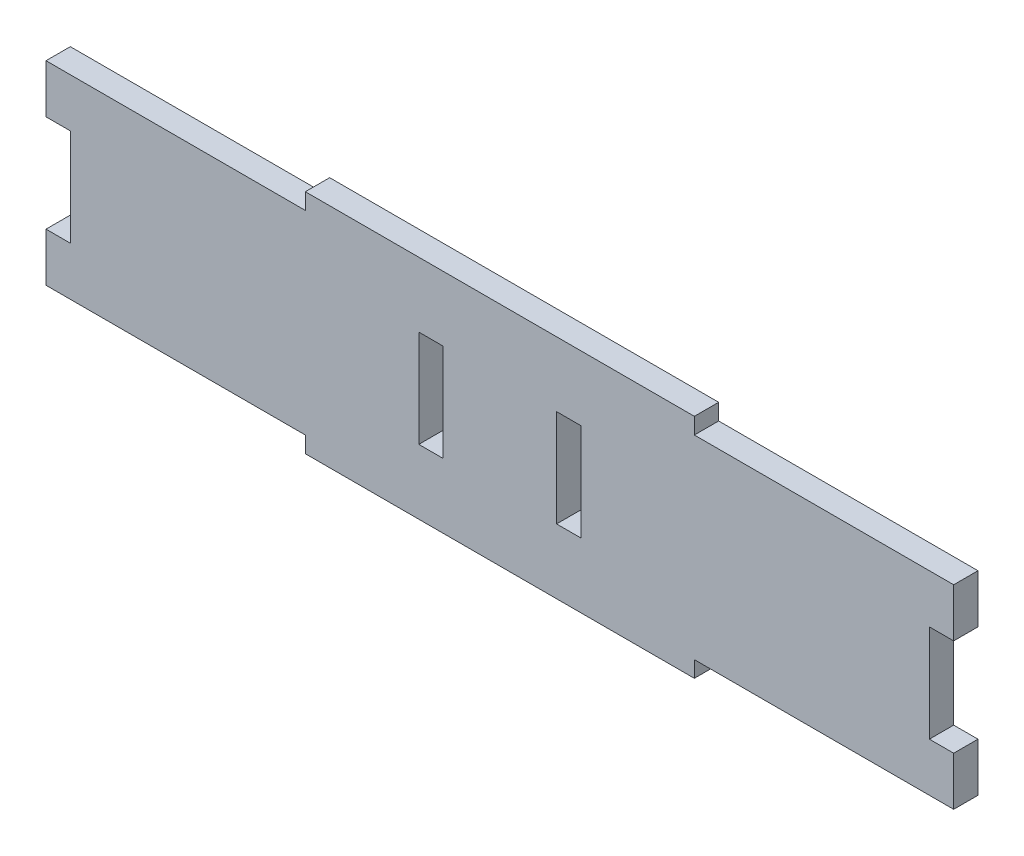
ISO-10303-21;
HEADER;
FILE_DESCRIPTION(('STEP AP214'),'2;1');
FILE_NAME('part.step','',(''),(''),'','','');
FILE_SCHEMA(('AUTOMOTIVE_DESIGN { 1 0 10303 214 1 1 1 1 }'));
ENDSEC;
DATA;
#1=APPLICATION_CONTEXT('core data for automotive mechanical design processes');
#2=APPLICATION_PROTOCOL_DEFINITION('international standard','automotive_design',2000,#1);
#3=PRODUCT_CONTEXT('',#1,'mechanical');
#4=PRODUCT('Part','Part','',(#3));
#5=PRODUCT_RELATED_PRODUCT_CATEGORY('part','',(#4));
#6=PRODUCT_DEFINITION_FORMATION('','',#4);
#7=PRODUCT_DEFINITION_CONTEXT('part definition',#1,'design');
#8=PRODUCT_DEFINITION('design','',#6,#7);
#9=PRODUCT_DEFINITION_SHAPE('','',#8);
#10=(LENGTH_UNIT() NAMED_UNIT(*) SI_UNIT(.MILLI.,.METRE.));
#11=(NAMED_UNIT(*) PLANE_ANGLE_UNIT() SI_UNIT($,.RADIAN.));
#12=(NAMED_UNIT(*) SI_UNIT($,.STERADIAN.) SOLID_ANGLE_UNIT());
#13=UNCERTAINTY_MEASURE_WITH_UNIT(LENGTH_MEASURE(1.E-05),#10,'distance_accuracy_value','');
#14=(GEOMETRIC_REPRESENTATION_CONTEXT(3) GLOBAL_UNCERTAINTY_ASSIGNED_CONTEXT((#13)) GLOBAL_UNIT_ASSIGNED_CONTEXT((#10,
#11,#12)) REPRESENTATION_CONTEXT('',''));
#15=CARTESIAN_POINT('',(0.,0.,0.));
#16=DIRECTION('',(0.,0.,1.));
#17=DIRECTION('',(1.,0.,0.));
#18=AXIS2_PLACEMENT_3D('',#15,#16,#17);
#19=CARTESIAN_POINT('',(0.,-19.0500000000008,9.525));
#20=DIRECTION('',(0.,1.,0.));
#21=DIRECTION('',(-1.,0.,0.));
#22=AXIS2_PLACEMENT_3D('',#19,#20,#21);
#23=PLANE('',#22);
#24=DIRECTION('',(1.,0.,0.));
#25=VECTOR('',#24,1.);
#26=CARTESIAN_POINT('',(0.,-19.0500000000008,0.));
#27=LINE('',#26,#25);
#28=CARTESIAN_POINT('',(168.275,-19.05,0.));
#29=VERTEX_POINT('',#28);
#30=CARTESIAN_POINT('',(177.8,-19.05,0.));
#31=VERTEX_POINT('',#30);
#32=EDGE_CURVE('E254',#29,#31,#27,.T.);
#33=ORIENTED_EDGE('',*,*,#32,.F.);
#34=DIRECTION('',(0.,0.,-1.));
#35=VECTOR('',#34,1.);
#36=CARTESIAN_POINT('',(168.275,-19.05,9.525));
#37=LINE('',#36,#35);
#38=CARTESIAN_POINT('',(168.275,-19.05,9.525));
#39=VERTEX_POINT('',#38);
#40=EDGE_CURVE('E11',#39,#29,#37,.T.);
#41=ORIENTED_EDGE('',*,*,#40,.F.);
#42=DIRECTION('',(1.,0.,0.));
#43=VECTOR('',#42,1.);
#44=CARTESIAN_POINT('',(0.,-19.0500000000008,9.525));
#45=LINE('',#44,#43);
#46=CARTESIAN_POINT('',(177.8,-19.05,9.525));
#47=VERTEX_POINT('',#46);
#48=EDGE_CURVE('E287',#39,#47,#45,.T.);
#49=ORIENTED_EDGE('',*,*,#48,.T.);
#50=DIRECTION('',(0.,0.,-1.));
#51=VECTOR('',#50,1.);
#52=CARTESIAN_POINT('',(177.8,-19.05,9.525));
#53=LINE('',#52,#51);
#54=EDGE_CURVE('E387',#47,#31,#53,.T.);
#55=ORIENTED_EDGE('',*,*,#54,.T.);
#56=EDGE_LOOP('',(#33,#41,#49,#55));
#57=FACE_BOUND('',#56,.T.);
#58=ADVANCED_FACE('F34',(#57),#23,.T.);
#59=CARTESIAN_POINT('',(168.275,0.,9.525));
#60=DIRECTION('',(-1.,0.,0.));
#61=DIRECTION('',(0.,0.,1.));
#62=AXIS2_PLACEMENT_3D('',#59,#60,#61);
#63=PLANE('',#62);
#64=DIRECTION('',(0.,1.,0.));
#65=VECTOR('',#64,1.);
#66=CARTESIAN_POINT('',(168.275,0.,0.));
#67=LINE('',#66,#65);
#68=CARTESIAN_POINT('',(168.275,19.05,0.));
#69=VERTEX_POINT('',#68);
#70=EDGE_CURVE('E337',#29,#69,#67,.T.);
#71=ORIENTED_EDGE('',*,*,#70,.T.);
#72=DIRECTION('',(0.,0.,-1.));
#73=VECTOR('',#72,1.);
#74=CARTESIAN_POINT('',(168.275,19.05,9.525));
#75=LINE('',#74,#73);
#76=CARTESIAN_POINT('',(168.275,19.05,9.525));
#77=VERTEX_POINT('',#76);
#78=EDGE_CURVE('E41',#77,#69,#75,.T.);
#79=ORIENTED_EDGE('',*,*,#78,.F.);
#80=DIRECTION('',(0.,1.,0.));
#81=VECTOR('',#80,1.);
#82=CARTESIAN_POINT('',(168.275,0.,9.525));
#83=LINE('',#82,#81);
#84=EDGE_CURVE('E290',#39,#77,#83,.T.);
#85=ORIENTED_EDGE('',*,*,#84,.F.);
#86=ORIENTED_EDGE('',*,*,#40,.T.);
#87=EDGE_LOOP('',(#71,#79,#85,#86));
#88=FACE_BOUND('',#87,.T.);
#89=ADVANCED_FACE('F432',(#88),#63,.F.);
#90=CARTESIAN_POINT('',(0.,19.0499999999992,9.525));
#91=DIRECTION('',(0.,-1.,0.));
#92=DIRECTION('',(1.,0.,0.));
#93=AXIS2_PLACEMENT_3D('',#90,#91,#92);
#94=PLANE('',#93);
#95=DIRECTION('',(-1.,0.,0.));
#96=VECTOR('',#95,1.);
#97=CARTESIAN_POINT('',(0.,19.0499999999992,0.));
#98=LINE('',#97,#96);
#99=CARTESIAN_POINT('',(177.8,19.05,0.));
#100=VERTEX_POINT('',#99);
#101=EDGE_CURVE('E340',#100,#69,#98,.T.);
#102=ORIENTED_EDGE('',*,*,#101,.F.);
#103=DIRECTION('',(0.,0.,-1.));
#104=VECTOR('',#103,1.);
#105=CARTESIAN_POINT('',(177.8,19.05,9.525));
#106=LINE('',#105,#104);
#107=CARTESIAN_POINT('',(177.8,19.05,9.525));
#108=VERTEX_POINT('',#107);
#109=EDGE_CURVE('E423',#108,#100,#106,.T.);
#110=ORIENTED_EDGE('',*,*,#109,.F.);
#111=DIRECTION('',(-1.,0.,0.));
#112=VECTOR('',#111,1.);
#113=CARTESIAN_POINT('',(0.,19.0499999999992,9.525));
#114=LINE('',#113,#112);
#115=EDGE_CURVE('E293',#108,#77,#114,.T.);
#116=ORIENTED_EDGE('',*,*,#115,.T.);
#117=ORIENTED_EDGE('',*,*,#78,.T.);
#118=EDGE_LOOP('',(#102,#110,#116,#117));
#119=FACE_BOUND('',#118,.T.);
#120=ADVANCED_FACE('F427',(#119),#94,.T.);
#121=CARTESIAN_POINT('',(177.8,0.,9.525));
#122=DIRECTION('',(-1.,0.,0.));
#123=DIRECTION('',(0.,0.,1.));
#124=AXIS2_PLACEMENT_3D('',#121,#122,#123);
#125=PLANE('',#124);
#126=DIRECTION('',(0.,1.,0.));
#127=VECTOR('',#126,1.);
#128=CARTESIAN_POINT('',(177.8,0.,0.));
#129=LINE('',#128,#127);
#130=CARTESIAN_POINT('',(177.8,38.1,0.));
#131=VERTEX_POINT('',#130);
#132=EDGE_CURVE('E343',#100,#131,#129,.T.);
#133=ORIENTED_EDGE('',*,*,#132,.T.);
#134=DIRECTION('',(0.,0.,-1.));
#135=VECTOR('',#134,1.);
#136=CARTESIAN_POINT('',(177.8,38.1,9.525));
#137=LINE('',#136,#135);
#138=CARTESIAN_POINT('',(177.8,38.1,9.525));
#139=VERTEX_POINT('',#138);
#140=EDGE_CURVE('E421',#139,#131,#137,.T.);
#141=ORIENTED_EDGE('',*,*,#140,.F.);
#142=DIRECTION('',(0.,1.,0.));
#143=VECTOR('',#142,1.);
#144=CARTESIAN_POINT('',(177.8,0.,9.525));
#145=LINE('',#144,#143);
#146=EDGE_CURVE('E296',#108,#139,#145,.T.);
#147=ORIENTED_EDGE('',*,*,#146,.F.);
#148=ORIENTED_EDGE('',*,*,#109,.T.);
#149=EDGE_LOOP('',(#133,#141,#147,#148));
#150=FACE_BOUND('',#149,.T.);
#151=ADVANCED_FACE('F440',(#150),#125,.F.);
#152=CARTESIAN_POINT('',(0.,38.1,9.525));
#153=DIRECTION('',(0.,1.,0.));
#154=DIRECTION('',(0.,0.,1.));
#155=AXIS2_PLACEMENT_3D('',#152,#153,#154);
#156=PLANE('',#155);
#157=DIRECTION('',(1.,0.,0.));
#158=VECTOR('',#157,1.);
#159=CARTESIAN_POINT('',(0.,38.1,0.));
#160=LINE('',#159,#158);
#161=CARTESIAN_POINT('',(76.2,38.1,0.));
#162=VERTEX_POINT('',#161);
#163=EDGE_CURVE('E346',#162,#131,#160,.T.);
#164=ORIENTED_EDGE('',*,*,#163,.F.);
#165=DIRECTION('',(0.,0.,-1.));
#166=VECTOR('',#165,1.);
#167=CARTESIAN_POINT('',(76.2,38.1,9.525));
#168=LINE('',#167,#166);
#169=CARTESIAN_POINT('',(76.2,38.1,9.525));
#170=VERTEX_POINT('',#169);
#171=EDGE_CURVE('E419',#170,#162,#168,.T.);
#172=ORIENTED_EDGE('',*,*,#171,.F.);
#173=DIRECTION('',(1.,0.,0.));
#174=VECTOR('',#173,1.);
#175=CARTESIAN_POINT('',(0.,38.1,9.525));
#176=LINE('',#175,#174);
#177=EDGE_CURVE('E298',#170,#139,#176,.T.);
#178=ORIENTED_EDGE('',*,*,#177,.T.);
#179=ORIENTED_EDGE('',*,*,#140,.T.);
#180=EDGE_LOOP('',(#164,#172,#178,#179));
#181=FACE_BOUND('',#180,.T.);
#182=ADVANCED_FACE('F515',(#181),#156,.T.);
#183=CARTESIAN_POINT('',(76.2,0.,9.525));
#184=DIRECTION('',(-1.,0.,0.));
#185=DIRECTION('',(0.,0.,1.));
#186=AXIS2_PLACEMENT_3D('',#183,#184,#185);
#187=PLANE('',#186);
#188=DIRECTION('',(0.,1.,0.));
#189=VECTOR('',#188,1.);
#190=CARTESIAN_POINT('',(76.2,0.,0.));
#191=LINE('',#190,#189);
#192=CARTESIAN_POINT('',(76.2,44.45,0.));
#193=VERTEX_POINT('',#192);
#194=EDGE_CURVE('E349',#162,#193,#191,.T.);
#195=ORIENTED_EDGE('',*,*,#194,.T.);
#196=DIRECTION('',(0.,0.,-1.));
#197=VECTOR('',#196,1.);
#198=CARTESIAN_POINT('',(76.2,44.45,9.525));
#199=LINE('',#198,#197);
#200=CARTESIAN_POINT('',(76.2,44.45,9.525));
#201=VERTEX_POINT('',#200);
#202=EDGE_CURVE('E417',#201,#193,#199,.T.);
#203=ORIENTED_EDGE('',*,*,#202,.F.);
#204=DIRECTION('',(0.,1.,0.));
#205=VECTOR('',#204,1.);
#206=CARTESIAN_POINT('',(76.2,0.,9.525));
#207=LINE('',#206,#205);
#208=EDGE_CURVE('E302',#170,#201,#207,.T.);
#209=ORIENTED_EDGE('',*,*,#208,.F.);
#210=ORIENTED_EDGE('',*,*,#171,.T.);
#211=EDGE_LOOP('',(#195,#203,#209,#210));
#212=FACE_BOUND('',#211,.T.);
#213=ADVANCED_FACE('F513',(#212),#187,.F.);
#214=CARTESIAN_POINT('',(0.,44.45,9.525));
#215=DIRECTION('',(0.,1.,0.));
#216=DIRECTION('',(0.,0.,1.));
#217=AXIS2_PLACEMENT_3D('',#214,#215,#216);
#218=PLANE('',#217);
#219=DIRECTION('',(1.,0.,0.));
#220=VECTOR('',#219,1.);
#221=CARTESIAN_POINT('',(0.,44.45,0.));
#222=LINE('',#221,#220);
#223=CARTESIAN_POINT('',(-76.2,44.45,0.));
#224=VERTEX_POINT('',#223);
#225=EDGE_CURVE('E352',#224,#193,#222,.T.);
#226=ORIENTED_EDGE('',*,*,#225,.F.);
#227=DIRECTION('',(0.,0.,-1.));
#228=VECTOR('',#227,1.);
#229=CARTESIAN_POINT('',(-76.2,44.45,9.525));
#230=LINE('',#229,#228);
#231=CARTESIAN_POINT('',(-76.2,44.45,9.525));
#232=VERTEX_POINT('',#231);
#233=EDGE_CURVE('E415',#232,#224,#230,.T.);
#234=ORIENTED_EDGE('',*,*,#233,.F.);
#235=DIRECTION('',(1.,0.,0.));
#236=VECTOR('',#235,1.);
#237=CARTESIAN_POINT('',(0.,44.45,9.525));
#238=LINE('',#237,#236);
#239=EDGE_CURVE('E304',#232,#201,#238,.T.);
#240=ORIENTED_EDGE('',*,*,#239,.T.);
#241=ORIENTED_EDGE('',*,*,#202,.T.);
#242=EDGE_LOOP('',(#226,#234,#240,#241));
#243=FACE_BOUND('',#242,.T.);
#244=ADVANCED_FACE('F507',(#243),#218,.T.);
#245=CARTESIAN_POINT('',(-76.2,0.,9.525));
#246=DIRECTION('',(1.,0.,0.));
#247=DIRECTION('',(0.,0.,-1.));
#248=AXIS2_PLACEMENT_3D('',#245,#246,#247);
#249=PLANE('',#248);
#250=DIRECTION('',(0.,-1.,0.));
#251=VECTOR('',#250,1.);
#252=CARTESIAN_POINT('',(-76.2,0.,0.));
#253=LINE('',#252,#251);
#254=CARTESIAN_POINT('',(-76.2,38.1,0.));
#255=VERTEX_POINT('',#254);
#256=EDGE_CURVE('E355',#224,#255,#253,.T.);
#257=ORIENTED_EDGE('',*,*,#256,.T.);
#258=DIRECTION('',(0.,0.,-1.));
#259=VECTOR('',#258,1.);
#260=CARTESIAN_POINT('',(-76.2,38.1,9.525));
#261=LINE('',#260,#259);
#262=CARTESIAN_POINT('',(-76.2,38.1,9.525));
#263=VERTEX_POINT('',#262);
#264=EDGE_CURVE('E412',#263,#255,#261,.T.);
#265=ORIENTED_EDGE('',*,*,#264,.F.);
#266=DIRECTION('',(0.,-1.,0.));
#267=VECTOR('',#266,1.);
#268=CARTESIAN_POINT('',(-76.2,0.,9.525));
#269=LINE('',#268,#267);
#270=EDGE_CURVE('E307',#232,#263,#269,.T.);
#271=ORIENTED_EDGE('',*,*,#270,.F.);
#272=ORIENTED_EDGE('',*,*,#233,.T.);
#273=EDGE_LOOP('',(#257,#265,#271,#272));
#274=FACE_BOUND('',#273,.T.);
#275=ADVANCED_FACE('F516',(#274),#249,.F.);
#276=CARTESIAN_POINT('',(0.,38.1,9.525));
#277=DIRECTION('',(0.,-1.,0.));
#278=DIRECTION('',(1.,0.,0.));
#279=AXIS2_PLACEMENT_3D('',#276,#277,#278);
#280=PLANE('',#279);
#281=DIRECTION('',(-1.,0.,0.));
#282=VECTOR('',#281,1.);
#283=CARTESIAN_POINT('',(0.,38.1,0.));
#284=LINE('',#283,#282);
#285=CARTESIAN_POINT('',(-177.8,38.1,0.));
#286=VERTEX_POINT('',#285);
#287=EDGE_CURVE('E357',#255,#286,#284,.T.);
#288=ORIENTED_EDGE('',*,*,#287,.T.);
#289=DIRECTION('',(0.,0.,-1.));
#290=VECTOR('',#289,1.);
#291=CARTESIAN_POINT('',(-177.8,38.1,9.525));
#292=LINE('',#291,#290);
#293=CARTESIAN_POINT('',(-177.8,38.1,9.525));
#294=VERTEX_POINT('',#293);
#295=EDGE_CURVE('E410',#294,#286,#292,.T.);
#296=ORIENTED_EDGE('',*,*,#295,.F.);
#297=DIRECTION('',(-1.,0.,0.));
#298=VECTOR('',#297,1.);
#299=CARTESIAN_POINT('',(0.,38.1,9.525));
#300=LINE('',#299,#298);
#301=EDGE_CURVE('E309',#263,#294,#300,.T.);
#302=ORIENTED_EDGE('',*,*,#301,.F.);
#303=ORIENTED_EDGE('',*,*,#264,.T.);
#304=EDGE_LOOP('',(#288,#296,#302,#303));
#305=FACE_BOUND('',#304,.T.);
#306=ADVANCED_FACE('F501',(#305),#280,.F.);
#307=CARTESIAN_POINT('',(-177.8,0.,9.525));
#308=DIRECTION('',(-1.,0.,0.));
#309=DIRECTION('',(0.,0.,1.));
#310=AXIS2_PLACEMENT_3D('',#307,#308,#309);
#311=PLANE('',#310);
#312=DIRECTION('',(0.,1.,0.));
#313=VECTOR('',#312,1.);
#314=CARTESIAN_POINT('',(-177.8,0.,0.));
#315=LINE('',#314,#313);
#316=CARTESIAN_POINT('',(-177.8,19.05,0.));
#317=VERTEX_POINT('',#316);
#318=EDGE_CURVE('E360',#317,#286,#315,.T.);
#319=ORIENTED_EDGE('',*,*,#318,.F.);
#320=DIRECTION('',(0.,0.,-1.));
#321=VECTOR('',#320,1.);
#322=CARTESIAN_POINT('',(-177.8,19.05,9.525));
#323=LINE('',#322,#321);
#324=CARTESIAN_POINT('',(-177.8,19.05,9.525));
#325=VERTEX_POINT('',#324);
#326=EDGE_CURVE('E408',#325,#317,#323,.T.);
#327=ORIENTED_EDGE('',*,*,#326,.F.);
#328=DIRECTION('',(0.,1.,0.));
#329=VECTOR('',#328,1.);
#330=CARTESIAN_POINT('',(-177.8,0.,9.525));
#331=LINE('',#330,#329);
#332=EDGE_CURVE('E311',#325,#294,#331,.T.);
#333=ORIENTED_EDGE('',*,*,#332,.T.);
#334=ORIENTED_EDGE('',*,*,#295,.T.);
#335=EDGE_LOOP('',(#319,#327,#333,#334));
#336=FACE_BOUND('',#335,.T.);
#337=ADVANCED_FACE('F495',(#336),#311,.T.);
#338=CARTESIAN_POINT('',(0.,19.05,9.525));
#339=DIRECTION('',(0.,1.,0.));
#340=DIRECTION('',(0.,0.,1.));
#341=AXIS2_PLACEMENT_3D('',#338,#339,#340);
#342=PLANE('',#341);
#343=DIRECTION('',(1.,0.,0.));
#344=VECTOR('',#343,1.);
#345=CARTESIAN_POINT('',(0.,19.05,0.));
#346=LINE('',#345,#344);
#347=CARTESIAN_POINT('',(-168.275,19.05,0.));
#348=VERTEX_POINT('',#347);
#349=EDGE_CURVE('E363',#317,#348,#346,.T.);
#350=ORIENTED_EDGE('',*,*,#349,.T.);
#351=DIRECTION('',(0.,0.,-1.));
#352=VECTOR('',#351,1.);
#353=CARTESIAN_POINT('',(-168.275,19.05,9.525));
#354=LINE('',#353,#352);
#355=CARTESIAN_POINT('',(-168.275,19.05,9.525));
#356=VERTEX_POINT('',#355);
#357=EDGE_CURVE('E406',#356,#348,#354,.T.);
#358=ORIENTED_EDGE('',*,*,#357,.F.);
#359=DIRECTION('',(1.,0.,0.));
#360=VECTOR('',#359,1.);
#361=CARTESIAN_POINT('',(0.,19.05,9.525));
#362=LINE('',#361,#360);
#363=EDGE_CURVE('E314',#325,#356,#362,.T.);
#364=ORIENTED_EDGE('',*,*,#363,.F.);
#365=ORIENTED_EDGE('',*,*,#326,.T.);
#366=EDGE_LOOP('',(#350,#358,#364,#365));
#367=FACE_BOUND('',#366,.T.);
#368=ADVANCED_FACE('F565',(#367),#342,.F.);
#369=CARTESIAN_POINT('',(-168.275,0.,9.525));
#370=DIRECTION('',(-1.,0.,0.));
#371=DIRECTION('',(0.,0.,1.));
#372=AXIS2_PLACEMENT_3D('',#369,#370,#371);
#373=PLANE('',#372);
#374=DIRECTION('',(0.,1.,0.));
#375=VECTOR('',#374,1.);
#376=CARTESIAN_POINT('',(-168.275,0.,0.));
#377=LINE('',#376,#375);
#378=CARTESIAN_POINT('',(-168.275,-19.05,0.));
#379=VERTEX_POINT('',#378);
#380=EDGE_CURVE('E367',#379,#348,#377,.T.);
#381=ORIENTED_EDGE('',*,*,#380,.F.);
#382=DIRECTION('',(0.,0.,-1.));
#383=VECTOR('',#382,1.);
#384=CARTESIAN_POINT('',(-168.275,-19.05,9.525));
#385=LINE('',#384,#383);
#386=CARTESIAN_POINT('',(-168.275,-19.05,9.525));
#387=VERTEX_POINT('',#386);
#388=EDGE_CURVE('E404',#387,#379,#385,.T.);
#389=ORIENTED_EDGE('',*,*,#388,.F.);
#390=DIRECTION('',(0.,1.,0.));
#391=VECTOR('',#390,1.);
#392=CARTESIAN_POINT('',(-168.275,0.,9.525));
#393=LINE('',#392,#391);
#394=EDGE_CURVE('E317',#387,#356,#393,.T.);
#395=ORIENTED_EDGE('',*,*,#394,.T.);
#396=ORIENTED_EDGE('',*,*,#357,.T.);
#397=EDGE_LOOP('',(#381,#389,#395,#396));
#398=FACE_BOUND('',#397,.T.);
#399=ADVANCED_FACE('F488',(#398),#373,.T.);
#400=CARTESIAN_POINT('',(0.,-19.05,9.525));
#401=DIRECTION('',(0.,-1.,0.));
#402=DIRECTION('',(0.,0.,-1.));
#403=AXIS2_PLACEMENT_3D('',#400,#401,#402);
#404=PLANE('',#403);
#405=DIRECTION('',(-1.,0.,0.));
#406=VECTOR('',#405,1.);
#407=CARTESIAN_POINT('',(0.,-19.05,0.));
#408=LINE('',#407,#406);
#409=CARTESIAN_POINT('',(-177.8,-19.05,0.));
#410=VERTEX_POINT('',#409);
#411=EDGE_CURVE('E370',#379,#410,#408,.T.);
#412=ORIENTED_EDGE('',*,*,#411,.T.);
#413=DIRECTION('',(0.,0.,-1.));
#414=VECTOR('',#413,1.);
#415=CARTESIAN_POINT('',(-177.8,-19.05,9.525));
#416=LINE('',#415,#414);
#417=CARTESIAN_POINT('',(-177.8,-19.05,9.525));
#418=VERTEX_POINT('',#417);
#419=EDGE_CURVE('E402',#418,#410,#416,.T.);
#420=ORIENTED_EDGE('',*,*,#419,.F.);
#421=DIRECTION('',(-1.,0.,0.));
#422=VECTOR('',#421,1.);
#423=CARTESIAN_POINT('',(0.,-19.05,9.525));
#424=LINE('',#423,#422);
#425=EDGE_CURVE('E320',#387,#418,#424,.T.);
#426=ORIENTED_EDGE('',*,*,#425,.F.);
#427=ORIENTED_EDGE('',*,*,#388,.T.);
#428=EDGE_LOOP('',(#412,#420,#426,#427));
#429=FACE_BOUND('',#428,.T.);
#430=ADVANCED_FACE('F485',(#429),#404,.F.);
#431=CARTESIAN_POINT('',(-177.8,-38.1,0.));
#432=VERTEX_POINT('',#431);
#433=EDGE_CURVE('E364',#432,#410,#315,.T.);
#434=ORIENTED_EDGE('',*,*,#433,.F.);
#435=DIRECTION('',(0.,0.,-1.));
#436=VECTOR('',#435,1.);
#437=CARTESIAN_POINT('',(-177.8,-38.1,9.525));
#438=LINE('',#437,#436);
#439=CARTESIAN_POINT('',(-177.8,-38.1,9.525));
#440=VERTEX_POINT('',#439);
#441=EDGE_CURVE('E400',#440,#432,#438,.T.);
#442=ORIENTED_EDGE('',*,*,#441,.F.);
#443=EDGE_CURVE('E315',#440,#418,#331,.T.);
#444=ORIENTED_EDGE('',*,*,#443,.T.);
#445=ORIENTED_EDGE('',*,*,#419,.T.);
#446=EDGE_LOOP('',(#434,#442,#444,#445));
#447=FACE_BOUND('',#446,.T.);
#448=ADVANCED_FACE('F479',(#447),#311,.T.);
#449=CARTESIAN_POINT('',(0.,-38.1,9.525));
#450=DIRECTION('',(0.,-1.,0.));
#451=DIRECTION('',(1.,0.,0.));
#452=AXIS2_PLACEMENT_3D('',#449,#450,#451);
#453=PLANE('',#452);
#454=DIRECTION('',(-1.,0.,0.));
#455=VECTOR('',#454,1.);
#456=CARTESIAN_POINT('',(0.,-38.1,0.));
#457=LINE('',#456,#455);
#458=CARTESIAN_POINT('',(-76.2,-38.1,0.));
#459=VERTEX_POINT('',#458);
#460=EDGE_CURVE('E373',#459,#432,#457,.T.);
#461=ORIENTED_EDGE('',*,*,#460,.F.);
#462=DIRECTION('',(0.,0.,-1.));
#463=VECTOR('',#462,1.);
#464=CARTESIAN_POINT('',(-76.2,-38.1,9.525));
#465=LINE('',#464,#463);
#466=CARTESIAN_POINT('',(-76.2,-38.1,9.525));
#467=VERTEX_POINT('',#466);
#468=EDGE_CURVE('E398',#467,#459,#465,.T.);
#469=ORIENTED_EDGE('',*,*,#468,.F.);
#470=DIRECTION('',(-1.,0.,0.));
#471=VECTOR('',#470,1.);
#472=CARTESIAN_POINT('',(0.,-38.1,9.525));
#473=LINE('',#472,#471);
#474=EDGE_CURVE('E322',#467,#440,#473,.T.);
#475=ORIENTED_EDGE('',*,*,#474,.T.);
#476=ORIENTED_EDGE('',*,*,#441,.T.);
#477=EDGE_LOOP('',(#461,#469,#475,#476));
#478=FACE_BOUND('',#477,.T.);
#479=ADVANCED_FACE('F473',(#478),#453,.T.);
#480=CARTESIAN_POINT('',(-76.2,0.,9.525));
#481=DIRECTION('',(-1.,0.,0.));
#482=DIRECTION('',(0.,0.,1.));
#483=AXIS2_PLACEMENT_3D('',#480,#481,#482);
#484=PLANE('',#483);
#485=DIRECTION('',(0.,1.,0.));
#486=VECTOR('',#485,1.);
#487=CARTESIAN_POINT('',(-76.2,0.,0.));
#488=LINE('',#487,#486);
#489=CARTESIAN_POINT('',(-76.2,-44.45,0.));
#490=VERTEX_POINT('',#489);
#491=EDGE_CURVE('E376',#490,#459,#488,.T.);
#492=ORIENTED_EDGE('',*,*,#491,.F.);
#493=DIRECTION('',(0.,0.,-1.));
#494=VECTOR('',#493,1.);
#495=CARTESIAN_POINT('',(-76.2,-44.45,9.525));
#496=LINE('',#495,#494);
#497=CARTESIAN_POINT('',(-76.2,-44.45,9.525));
#498=VERTEX_POINT('',#497);
#499=EDGE_CURVE('E396',#498,#490,#496,.T.);
#500=ORIENTED_EDGE('',*,*,#499,.F.);
#501=DIRECTION('',(0.,1.,0.));
#502=VECTOR('',#501,1.);
#503=CARTESIAN_POINT('',(-76.2,0.,9.525));
#504=LINE('',#503,#502);
#505=EDGE_CURVE('E325',#498,#467,#504,.T.);
#506=ORIENTED_EDGE('',*,*,#505,.T.);
#507=ORIENTED_EDGE('',*,*,#468,.T.);
#508=EDGE_LOOP('',(#492,#500,#506,#507));
#509=FACE_BOUND('',#508,.T.);
#510=ADVANCED_FACE('F467',(#509),#484,.T.);
#511=CARTESIAN_POINT('',(0.,-44.45,9.525));
#512=DIRECTION('',(0.,1.,0.));
#513=DIRECTION('',(0.,0.,1.));
#514=AXIS2_PLACEMENT_3D('',#511,#512,#513);
#515=PLANE('',#514);
#516=DIRECTION('',(1.,0.,0.));
#517=VECTOR('',#516,1.);
#518=CARTESIAN_POINT('',(0.,-44.45,0.));
#519=LINE('',#518,#517);
#520=CARTESIAN_POINT('',(76.2,-44.45,0.));
#521=VERTEX_POINT('',#520);
#522=EDGE_CURVE('E379',#490,#521,#519,.T.);
#523=ORIENTED_EDGE('',*,*,#522,.T.);
#524=DIRECTION('',(0.,0.,-1.));
#525=VECTOR('',#524,1.);
#526=CARTESIAN_POINT('',(76.2,-44.45,9.525));
#527=LINE('',#526,#525);
#528=CARTESIAN_POINT('',(76.2,-44.45,9.525));
#529=VERTEX_POINT('',#528);
#530=EDGE_CURVE('E394',#529,#521,#527,.T.);
#531=ORIENTED_EDGE('',*,*,#530,.F.);
#532=DIRECTION('',(1.,0.,0.));
#533=VECTOR('',#532,1.);
#534=CARTESIAN_POINT('',(0.,-44.45,9.525));
#535=LINE('',#534,#533);
#536=EDGE_CURVE('E328',#498,#529,#535,.T.);
#537=ORIENTED_EDGE('',*,*,#536,.F.);
#538=ORIENTED_EDGE('',*,*,#499,.T.);
#539=EDGE_LOOP('',(#523,#531,#537,#538));
#540=FACE_BOUND('',#539,.T.);
#541=ADVANCED_FACE('F613',(#540),#515,.F.);
#542=CARTESIAN_POINT('',(76.2,0.,9.525));
#543=DIRECTION('',(1.,0.,0.));
#544=DIRECTION('',(0.,0.,-1.));
#545=AXIS2_PLACEMENT_3D('',#542,#543,#544);
#546=PLANE('',#545);
#547=DIRECTION('',(0.,-1.,0.));
#548=VECTOR('',#547,1.);
#549=CARTESIAN_POINT('',(76.2,0.,0.));
#550=LINE('',#549,#548);
#551=CARTESIAN_POINT('',(76.2,-38.1,0.));
#552=VERTEX_POINT('',#551);
#553=EDGE_CURVE('E382',#552,#521,#550,.T.);
#554=ORIENTED_EDGE('',*,*,#553,.F.);
#555=DIRECTION('',(0.,0.,-1.));
#556=VECTOR('',#555,1.);
#557=CARTESIAN_POINT('',(76.2,-38.1,9.525));
#558=LINE('',#557,#556);
#559=CARTESIAN_POINT('',(76.2,-38.1,9.525));
#560=VERTEX_POINT('',#559);
#561=EDGE_CURVE('E392',#560,#552,#558,.T.);
#562=ORIENTED_EDGE('',*,*,#561,.F.);
#563=DIRECTION('',(0.,-1.,0.));
#564=VECTOR('',#563,1.);
#565=CARTESIAN_POINT('',(76.2,0.,9.525));
#566=LINE('',#565,#564);
#567=EDGE_CURVE('E330',#560,#529,#566,.T.);
#568=ORIENTED_EDGE('',*,*,#567,.T.);
#569=ORIENTED_EDGE('',*,*,#530,.T.);
#570=EDGE_LOOP('',(#554,#562,#568,#569));
#571=FACE_BOUND('',#570,.T.);
#572=ADVANCED_FACE('F461',(#571),#546,.T.);
#573=CARTESIAN_POINT('',(0.,-38.1,9.525));
#574=DIRECTION('',(0.,1.,0.));
#575=DIRECTION('',(0.,0.,1.));
#576=AXIS2_PLACEMENT_3D('',#573,#574,#575);
#577=PLANE('',#576);
#578=DIRECTION('',(1.,0.,0.));
#579=VECTOR('',#578,1.);
#580=CARTESIAN_POINT('',(0.,-38.1,0.));
#581=LINE('',#580,#579);
#582=CARTESIAN_POINT('',(177.8,-38.1,0.));
#583=VERTEX_POINT('',#582);
#584=EDGE_CURVE('E385',#552,#583,#581,.T.);
#585=ORIENTED_EDGE('',*,*,#584,.T.);
#586=DIRECTION('',(0.,0.,-1.));
#587=VECTOR('',#586,1.);
#588=CARTESIAN_POINT('',(177.8,-38.1,9.525));
#589=LINE('',#588,#587);
#590=CARTESIAN_POINT('',(177.8,-38.1,9.525));
#591=VERTEX_POINT('',#590);
#592=EDGE_CURVE('E389',#591,#583,#589,.T.);
#593=ORIENTED_EDGE('',*,*,#592,.F.);
#594=DIRECTION('',(1.,0.,0.));
#595=VECTOR('',#594,1.);
#596=CARTESIAN_POINT('',(0.,-38.1,9.525));
#597=LINE('',#596,#595);
#598=EDGE_CURVE('E333',#560,#591,#597,.T.);
#599=ORIENTED_EDGE('',*,*,#598,.F.);
#600=ORIENTED_EDGE('',*,*,#561,.T.);
#601=EDGE_LOOP('',(#585,#593,#599,#600));
#602=FACE_BOUND('',#601,.T.);
#603=ADVANCED_FACE('F458',(#602),#577,.F.);
#604=EDGE_CURVE('E291',#583,#31,#129,.T.);
#605=ORIENTED_EDGE('',*,*,#604,.T.);
#606=ORIENTED_EDGE('',*,*,#54,.F.);
#607=EDGE_CURVE('E299',#591,#47,#145,.T.);
#608=ORIENTED_EDGE('',*,*,#607,.F.);
#609=ORIENTED_EDGE('',*,*,#592,.T.);
#610=EDGE_LOOP('',(#605,#606,#608,#609));
#611=FACE_BOUND('',#610,.T.);
#612=ADVANCED_FACE('F454',(#611),#125,.F.);
#613=CARTESIAN_POINT('',(0.,0.,9.525));
#614=DIRECTION('',(0.,0.,1.));
#615=DIRECTION('',(1.,0.,0.));
#616=AXIS2_PLACEMENT_3D('',#613,#614,#615);
#617=PLANE('',#616);
#618=DIRECTION('',(-1.,0.,0.));
#619=VECTOR('',#618,1.);
#620=CARTESIAN_POINT('',(-22.225,19.05,9.525));
#621=LINE('',#620,#619);
#622=CARTESIAN_POINT('',(-22.225,19.05,9.525));
#623=VERTEX_POINT('',#622);
#624=CARTESIAN_POINT('',(-31.75,19.05,9.525));
#625=VERTEX_POINT('',#624);
#626=EDGE_CURVE('E48',#623,#625,#621,.T.);
#627=ORIENTED_EDGE('',*,*,#626,.F.);
#628=DIRECTION('',(0.,1.,0.));
#629=VECTOR('',#628,1.);
#630=CARTESIAN_POINT('',(-22.225,-19.05,9.525));
#631=LINE('',#630,#629);
#632=CARTESIAN_POINT('',(-22.225,-19.05,9.525));
#633=VERTEX_POINT('',#632);
#634=EDGE_CURVE('E238',#633,#623,#631,.T.);
#635=ORIENTED_EDGE('',*,*,#634,.F.);
#636=DIRECTION('',(1.,0.,0.));
#637=VECTOR('',#636,1.);
#638=CARTESIAN_POINT('',(-31.75,-19.05,9.525));
#639=LINE('',#638,#637);
#640=CARTESIAN_POINT('',(-31.75,-19.05,9.525));
#641=VERTEX_POINT('',#640);
#642=EDGE_CURVE('E241',#641,#633,#639,.T.);
#643=ORIENTED_EDGE('',*,*,#642,.F.);
#644=DIRECTION('',(0.,-1.,0.));
#645=VECTOR('',#644,1.);
#646=CARTESIAN_POINT('',(-31.75,19.05,9.525));
#647=LINE('',#646,#645);
#648=EDGE_CURVE('E247',#625,#641,#647,.T.);
#649=ORIENTED_EDGE('',*,*,#648,.F.);
#650=EDGE_LOOP('',(#627,#635,#643,#649));
#651=FACE_BOUND('',#650,.T.);
#652=DIRECTION('',(1.,0.,0.));
#653=VECTOR('',#652,1.);
#654=CARTESIAN_POINT('',(31.75,-19.05,9.525));
#655=LINE('',#654,#653);
#656=CARTESIAN_POINT('',(22.225,-19.05,9.525));
#657=VERTEX_POINT('',#656);
#658=CARTESIAN_POINT('',(31.75,-19.05,9.525));
#659=VERTEX_POINT('',#658);
#660=EDGE_CURVE('E56',#657,#659,#655,.T.);
#661=ORIENTED_EDGE('',*,*,#660,.F.);
#662=DIRECTION('',(0.,-1.,0.));
#663=VECTOR('',#662,1.);
#664=CARTESIAN_POINT('',(22.225,-19.05,9.525));
#665=LINE('',#664,#663);
#666=CARTESIAN_POINT('',(22.225,19.05,9.525));
#667=VERTEX_POINT('',#666);
#668=EDGE_CURVE('E262',#667,#657,#665,.T.);
#669=ORIENTED_EDGE('',*,*,#668,.F.);
#670=DIRECTION('',(-1.,0.,0.));
#671=VECTOR('',#670,1.);
#672=CARTESIAN_POINT('',(22.225,19.05,9.525));
#673=LINE('',#672,#671);
#674=CARTESIAN_POINT('',(31.75,19.05,9.525));
#675=VERTEX_POINT('',#674);
#676=EDGE_CURVE('E276',#675,#667,#673,.T.);
#677=ORIENTED_EDGE('',*,*,#676,.F.);
#678=DIRECTION('',(0.,1.,0.));
#679=VECTOR('',#678,1.);
#680=CARTESIAN_POINT('',(31.75,19.05,9.525));
#681=LINE('',#680,#679);
#682=EDGE_CURVE('E273',#659,#675,#681,.T.);
#683=ORIENTED_EDGE('',*,*,#682,.F.);
#684=EDGE_LOOP('',(#661,#669,#677,#683));
#685=FACE_BOUND('',#684,.T.);
#686=ORIENTED_EDGE('',*,*,#48,.F.);
#687=ORIENTED_EDGE('',*,*,#84,.T.);
#688=ORIENTED_EDGE('',*,*,#115,.F.);
#689=ORIENTED_EDGE('',*,*,#146,.T.);
#690=ORIENTED_EDGE('',*,*,#177,.F.);
#691=ORIENTED_EDGE('',*,*,#208,.T.);
#692=ORIENTED_EDGE('',*,*,#239,.F.);
#693=ORIENTED_EDGE('',*,*,#270,.T.);
#694=ORIENTED_EDGE('',*,*,#301,.T.);
#695=ORIENTED_EDGE('',*,*,#332,.F.);
#696=ORIENTED_EDGE('',*,*,#363,.T.);
#697=ORIENTED_EDGE('',*,*,#394,.F.);
#698=ORIENTED_EDGE('',*,*,#425,.T.);
#699=ORIENTED_EDGE('',*,*,#443,.F.);
#700=ORIENTED_EDGE('',*,*,#474,.F.);
#701=ORIENTED_EDGE('',*,*,#505,.F.);
#702=ORIENTED_EDGE('',*,*,#536,.T.);
#703=ORIENTED_EDGE('',*,*,#567,.F.);
#704=ORIENTED_EDGE('',*,*,#598,.T.);
#705=ORIENTED_EDGE('',*,*,#607,.T.);
#706=EDGE_LOOP('',(#686,#687,#688,#689,#690,#691,#692,#693,#694,#695,#696,#697,#698,#699,#700,
#701,#702,#703,#704,#705));
#707=FACE_BOUND('',#706,.T.);
#708=ADVANCED_FACE('F445',(#651,#685,#707),#617,.T.);
#709=CARTESIAN_POINT('',(0.,0.,0.));
#710=DIRECTION('',(0.,0.,1.));
#711=DIRECTION('',(1.,0.,0.));
#712=AXIS2_PLACEMENT_3D('',#709,#710,#711);
#713=PLANE('',#712);
#714=DIRECTION('',(0.,1.,0.));
#715=VECTOR('',#714,1.);
#716=CARTESIAN_POINT('',(-22.225,-19.05,0.));
#717=LINE('',#716,#715);
#718=CARTESIAN_POINT('',(-22.225,-19.05,0.));
#719=VERTEX_POINT('',#718);
#720=CARTESIAN_POINT('',(-22.225,19.05,0.));
#721=VERTEX_POINT('',#720);
#722=EDGE_CURVE('E225',#719,#721,#717,.T.);
#723=ORIENTED_EDGE('',*,*,#722,.T.);
#724=DIRECTION('',(-1.,0.,0.));
#725=VECTOR('',#724,1.);
#726=CARTESIAN_POINT('',(-22.225,19.05,0.));
#727=LINE('',#726,#725);
#728=CARTESIAN_POINT('',(-31.75,19.05,0.));
#729=VERTEX_POINT('',#728);
#730=EDGE_CURVE('E219',#721,#729,#727,.T.);
#731=ORIENTED_EDGE('',*,*,#730,.T.);
#732=DIRECTION('',(0.,-1.,0.));
#733=VECTOR('',#732,1.);
#734=CARTESIAN_POINT('',(-31.75,19.05,0.));
#735=LINE('',#734,#733);
#736=CARTESIAN_POINT('',(-31.75,-19.05,0.));
#737=VERTEX_POINT('',#736);
#738=EDGE_CURVE('E229',#729,#737,#735,.T.);
#739=ORIENTED_EDGE('',*,*,#738,.T.);
#740=DIRECTION('',(1.,0.,0.));
#741=VECTOR('',#740,1.);
#742=CARTESIAN_POINT('',(-31.75,-19.05,0.));
#743=LINE('',#742,#741);
#744=EDGE_CURVE('E233',#737,#719,#743,.T.);
#745=ORIENTED_EDGE('',*,*,#744,.T.);
#746=EDGE_LOOP('',(#723,#731,#739,#745));
#747=FACE_BOUND('',#746,.T.);
#748=DIRECTION('',(0.,-1.,0.));
#749=VECTOR('',#748,1.);
#750=CARTESIAN_POINT('',(22.225,-19.05,0.));
#751=LINE('',#750,#749);
#752=CARTESIAN_POINT('',(22.225,19.05,0.));
#753=VERTEX_POINT('',#752);
#754=CARTESIAN_POINT('',(22.225,-19.05,0.));
#755=VERTEX_POINT('',#754);
#756=EDGE_CURVE('E268',#753,#755,#751,.T.);
#757=ORIENTED_EDGE('',*,*,#756,.T.);
#758=DIRECTION('',(1.,0.,0.));
#759=VECTOR('',#758,1.);
#760=CARTESIAN_POINT('',(31.75,-19.05,0.));
#761=LINE('',#760,#759);
#762=CARTESIAN_POINT('',(31.75,-19.05,0.));
#763=VERTEX_POINT('',#762);
#764=EDGE_CURVE('E258',#755,#763,#761,.T.);
#765=ORIENTED_EDGE('',*,*,#764,.T.);
#766=DIRECTION('',(0.,1.,0.));
#767=VECTOR('',#766,1.);
#768=CARTESIAN_POINT('',(31.75,19.05,0.));
#769=LINE('',#768,#767);
#770=CARTESIAN_POINT('',(31.75,19.05,0.));
#771=VERTEX_POINT('',#770);
#772=EDGE_CURVE('E261',#763,#771,#769,.T.);
#773=ORIENTED_EDGE('',*,*,#772,.T.);
#774=DIRECTION('',(-1.,0.,0.));
#775=VECTOR('',#774,1.);
#776=CARTESIAN_POINT('',(22.225,19.05,0.));
#777=LINE('',#776,#775);
#778=EDGE_CURVE('E265',#771,#753,#777,.T.);
#779=ORIENTED_EDGE('',*,*,#778,.T.);
#780=EDGE_LOOP('',(#757,#765,#773,#779));
#781=FACE_BOUND('',#780,.T.);
#782=ORIENTED_EDGE('',*,*,#32,.T.);
#783=ORIENTED_EDGE('',*,*,#604,.F.);
#784=ORIENTED_EDGE('',*,*,#584,.F.);
#785=ORIENTED_EDGE('',*,*,#553,.T.);
#786=ORIENTED_EDGE('',*,*,#522,.F.);
#787=ORIENTED_EDGE('',*,*,#491,.T.);
#788=ORIENTED_EDGE('',*,*,#460,.T.);
#789=ORIENTED_EDGE('',*,*,#433,.T.);
#790=ORIENTED_EDGE('',*,*,#411,.F.);
#791=ORIENTED_EDGE('',*,*,#380,.T.);
#792=ORIENTED_EDGE('',*,*,#349,.F.);
#793=ORIENTED_EDGE('',*,*,#318,.T.);
#794=ORIENTED_EDGE('',*,*,#287,.F.);
#795=ORIENTED_EDGE('',*,*,#256,.F.);
#796=ORIENTED_EDGE('',*,*,#225,.T.);
#797=ORIENTED_EDGE('',*,*,#194,.F.);
#798=ORIENTED_EDGE('',*,*,#163,.T.);
#799=ORIENTED_EDGE('',*,*,#132,.F.);
#800=ORIENTED_EDGE('',*,*,#101,.T.);
#801=ORIENTED_EDGE('',*,*,#70,.F.);
#802=EDGE_LOOP('',(#782,#783,#784,#785,#786,#787,#788,#789,#790,#791,#792,#793,#794,#795,#796,
#797,#798,#799,#800,#801));
#803=FACE_BOUND('',#802,.T.);
#804=ADVANCED_FACE('F235',(#747,#781,#803),#713,.F.);
#805=CARTESIAN_POINT('',(31.75,-19.05,0.));
#806=DIRECTION('',(0.,-1.,0.));
#807=DIRECTION('',(0.,0.,-1.));
#808=AXIS2_PLACEMENT_3D('',#805,#806,#807);
#809=PLANE('',#808);
#810=ORIENTED_EDGE('',*,*,#660,.T.);
#811=DIRECTION('',(0.,0.,1.));
#812=VECTOR('',#811,1.);
#813=CARTESIAN_POINT('',(31.75,-19.05,0.));
#814=LINE('',#813,#812);
#815=EDGE_CURVE('E271',#763,#659,#814,.T.);
#816=ORIENTED_EDGE('',*,*,#815,.F.);
#817=ORIENTED_EDGE('',*,*,#764,.F.);
#818=DIRECTION('',(0.,0.,1.));
#819=VECTOR('',#818,1.);
#820=CARTESIAN_POINT('',(22.225,-19.05,0.));
#821=LINE('',#820,#819);
#822=EDGE_CURVE('E248',#755,#657,#821,.T.);
#823=ORIENTED_EDGE('',*,*,#822,.T.);
#824=EDGE_LOOP('',(#810,#816,#817,#823));
#825=FACE_BOUND('',#824,.T.);
#826=ADVANCED_FACE('F661',(#825),#809,.F.);
#827=CARTESIAN_POINT('',(22.225,-19.05,0.));
#828=DIRECTION('',(-1.,0.,0.));
#829=DIRECTION('',(0.,0.,1.));
#830=AXIS2_PLACEMENT_3D('',#827,#828,#829);
#831=PLANE('',#830);
#832=ORIENTED_EDGE('',*,*,#668,.T.);
#833=ORIENTED_EDGE('',*,*,#822,.F.);
#834=ORIENTED_EDGE('',*,*,#756,.F.);
#835=DIRECTION('',(0.,0.,1.));
#836=VECTOR('',#835,1.);
#837=CARTESIAN_POINT('',(22.225,19.05,0.));
#838=LINE('',#837,#836);
#839=EDGE_CURVE('E282',#753,#667,#838,.T.);
#840=ORIENTED_EDGE('',*,*,#839,.T.);
#841=EDGE_LOOP('',(#832,#833,#834,#840));
#842=FACE_BOUND('',#841,.T.);
#843=ADVANCED_FACE('F669',(#842),#831,.F.);
#844=CARTESIAN_POINT('',(22.225,19.05,0.));
#845=DIRECTION('',(0.,1.,0.));
#846=DIRECTION('',(-1.,0.,0.));
#847=AXIS2_PLACEMENT_3D('',#844,#845,#846);
#848=PLANE('',#847);
#849=ORIENTED_EDGE('',*,*,#676,.T.);
#850=ORIENTED_EDGE('',*,*,#839,.F.);
#851=ORIENTED_EDGE('',*,*,#778,.F.);
#852=DIRECTION('',(0.,0.,1.));
#853=VECTOR('',#852,1.);
#854=CARTESIAN_POINT('',(31.75,19.05,0.));
#855=LINE('',#854,#853);
#856=EDGE_CURVE('E284',#771,#675,#855,.T.);
#857=ORIENTED_EDGE('',*,*,#856,.T.);
#858=EDGE_LOOP('',(#849,#850,#851,#857));
#859=FACE_BOUND('',#858,.T.);
#860=ADVANCED_FACE('F678',(#859),#848,.F.);
#861=CARTESIAN_POINT('',(31.75,19.05,0.));
#862=DIRECTION('',(1.,0.,0.));
#863=DIRECTION('',(0.,1.,0.));
#864=AXIS2_PLACEMENT_3D('',#861,#862,#863);
#865=PLANE('',#864);
#866=ORIENTED_EDGE('',*,*,#682,.T.);
#867=ORIENTED_EDGE('',*,*,#856,.F.);
#868=ORIENTED_EDGE('',*,*,#772,.F.);
#869=ORIENTED_EDGE('',*,*,#815,.T.);
#870=EDGE_LOOP('',(#866,#867,#868,#869));
#871=FACE_BOUND('',#870,.T.);
#872=ADVANCED_FACE('F688',(#871),#865,.F.);
#873=CARTESIAN_POINT('',(-22.225,19.05,0.));
#874=DIRECTION('',(0.,1.,0.));
#875=DIRECTION('',(-1.,0.,0.));
#876=AXIS2_PLACEMENT_3D('',#873,#874,#875);
#877=PLANE('',#876);
#878=ORIENTED_EDGE('',*,*,#626,.T.);
#879=DIRECTION('',(0.,0.,1.));
#880=VECTOR('',#879,1.);
#881=CARTESIAN_POINT('',(-31.75,19.05,0.));
#882=LINE('',#881,#880);
#883=EDGE_CURVE('E215',#729,#625,#882,.T.);
#884=ORIENTED_EDGE('',*,*,#883,.F.);
#885=ORIENTED_EDGE('',*,*,#730,.F.);
#886=DIRECTION('',(0.,0.,1.));
#887=VECTOR('',#886,1.);
#888=CARTESIAN_POINT('',(-22.225,19.05,0.));
#889=LINE('',#888,#887);
#890=EDGE_CURVE('E252',#721,#623,#889,.T.);
#891=ORIENTED_EDGE('',*,*,#890,.T.);
#892=EDGE_LOOP('',(#878,#884,#885,#891));
#893=FACE_BOUND('',#892,.T.);
#894=ADVANCED_FACE('F217',(#893),#877,.F.);
#895=CARTESIAN_POINT('',(-22.225,-19.05,0.));
#896=DIRECTION('',(1.,0.,0.));
#897=DIRECTION('',(0.,0.,-1.));
#898=AXIS2_PLACEMENT_3D('',#895,#896,#897);
#899=PLANE('',#898);
#900=ORIENTED_EDGE('',*,*,#634,.T.);
#901=ORIENTED_EDGE('',*,*,#890,.F.);
#902=ORIENTED_EDGE('',*,*,#722,.F.);
#903=DIRECTION('',(0.,0.,1.));
#904=VECTOR('',#903,1.);
#905=CARTESIAN_POINT('',(-22.225,-19.05,0.));
#906=LINE('',#905,#904);
#907=EDGE_CURVE('E255',#719,#633,#906,.T.);
#908=ORIENTED_EDGE('',*,*,#907,.T.);
#909=EDGE_LOOP('',(#900,#901,#902,#908));
#910=FACE_BOUND('',#909,.T.);
#911=ADVANCED_FACE('F707',(#910),#899,.F.);
#912=CARTESIAN_POINT('',(-31.75,-19.05,0.));
#913=DIRECTION('',(0.,-1.,0.));
#914=DIRECTION('',(0.,0.,-1.));
#915=AXIS2_PLACEMENT_3D('',#912,#913,#914);
#916=PLANE('',#915);
#917=ORIENTED_EDGE('',*,*,#642,.T.);
#918=ORIENTED_EDGE('',*,*,#907,.F.);
#919=ORIENTED_EDGE('',*,*,#744,.F.);
#920=DIRECTION('',(0.,0.,1.));
#921=VECTOR('',#920,1.);
#922=CARTESIAN_POINT('',(-31.75,-19.05,0.));
#923=LINE('',#922,#921);
#924=EDGE_CURVE('E224',#737,#641,#923,.T.);
#925=ORIENTED_EDGE('',*,*,#924,.T.);
#926=EDGE_LOOP('',(#917,#918,#919,#925));
#927=FACE_BOUND('',#926,.T.);
#928=ADVANCED_FACE('F716',(#927),#916,.F.);
#929=CARTESIAN_POINT('',(-31.75,19.05,0.));
#930=DIRECTION('',(-1.,0.,0.));
#931=DIRECTION('',(0.,-1.,0.));
#932=AXIS2_PLACEMENT_3D('',#929,#930,#931);
#933=PLANE('',#932);
#934=ORIENTED_EDGE('',*,*,#648,.T.);
#935=ORIENTED_EDGE('',*,*,#924,.F.);
#936=ORIENTED_EDGE('',*,*,#738,.F.);
#937=ORIENTED_EDGE('',*,*,#883,.T.);
#938=EDGE_LOOP('',(#934,#935,#936,#937));
#939=FACE_BOUND('',#938,.T.);
#940=ADVANCED_FACE('F230',(#939),#933,.F.);
#941=CLOSED_SHELL('',(#58,#89,#120,#151,#182,#213,#244,#275,#306,#337,#368,#399,#430,#448,#479,
#510,#541,#572,#603,#612,#708,#804,#826,#843,#860,#872,#894,#911,#928,#940));
#942=MANIFOLD_SOLID_BREP('B2',#941);
#943=ADVANCED_BREP_SHAPE_REPRESENTATION('',(#18,#942),#14);
#944=SHAPE_DEFINITION_REPRESENTATION(#9,#943);
ENDSEC;
END-ISO-10303-21;
